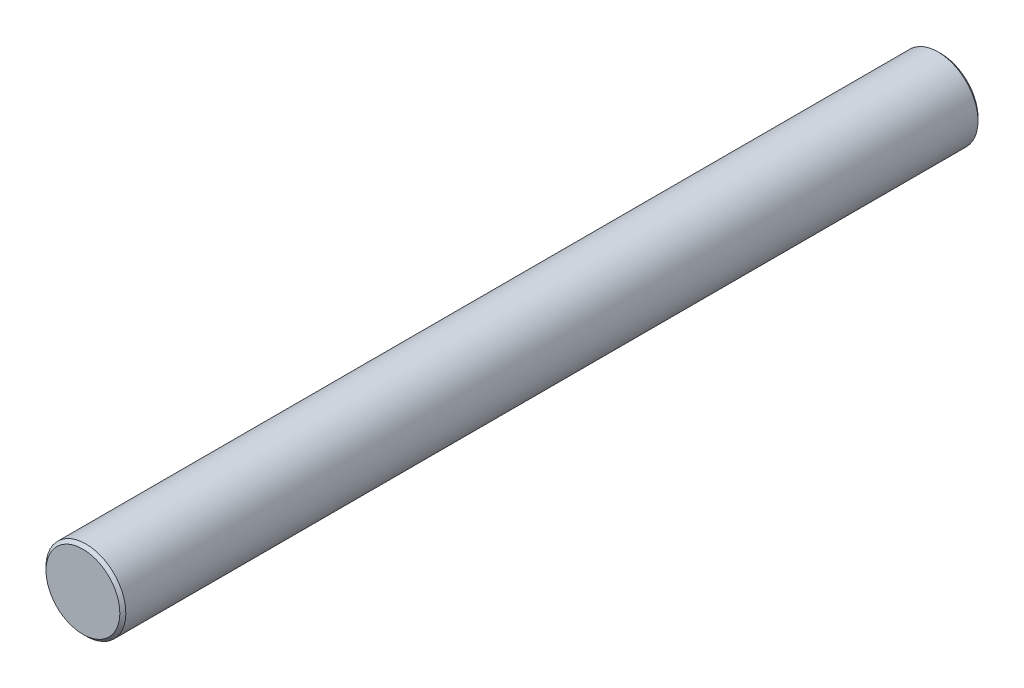
ISO-10303-21;
HEADER;
FILE_DESCRIPTION(('STEP AP214'),'2;1');
FILE_NAME('part.step','',(''),(''),'','','');
FILE_SCHEMA(('AUTOMOTIVE_DESIGN { 1 0 10303 214 1 1 1 1 }'));
ENDSEC;
DATA;
#1=APPLICATION_CONTEXT('core data for automotive mechanical design processes');
#2=APPLICATION_PROTOCOL_DEFINITION('international standard','automotive_design',2000,#1);
#3=PRODUCT_CONTEXT('',#1,'mechanical');
#4=PRODUCT('Part','Part','',(#3));
#5=PRODUCT_RELATED_PRODUCT_CATEGORY('part','',(#4));
#6=PRODUCT_DEFINITION_FORMATION('','',#4);
#7=PRODUCT_DEFINITION_CONTEXT('part definition',#1,'design');
#8=PRODUCT_DEFINITION('design','',#6,#7);
#9=PRODUCT_DEFINITION_SHAPE('','',#8);
#10=(LENGTH_UNIT() NAMED_UNIT(*) SI_UNIT(.MILLI.,.METRE.));
#11=(NAMED_UNIT(*) PLANE_ANGLE_UNIT() SI_UNIT($,.RADIAN.));
#12=(NAMED_UNIT(*) SI_UNIT($,.STERADIAN.) SOLID_ANGLE_UNIT());
#13=UNCERTAINTY_MEASURE_WITH_UNIT(LENGTH_MEASURE(1.E-05),#10,'distance_accuracy_value','');
#14=(GEOMETRIC_REPRESENTATION_CONTEXT(3) GLOBAL_UNCERTAINTY_ASSIGNED_CONTEXT((#13)) GLOBAL_UNIT_ASSIGNED_CONTEXT((#10,
#11,#12)) REPRESENTATION_CONTEXT('',''));
#15=CARTESIAN_POINT('',(0.,0.,0.));
#16=DIRECTION('',(0.,0.,1.));
#17=DIRECTION('',(1.,0.,0.));
#18=AXIS2_PLACEMENT_3D('',#15,#16,#17);
#19=CARTESIAN_POINT('',(0.,9.25,0.));
#20=DIRECTION('',(0.,0.,-1.));
#21=DIRECTION('',(0.,1.,0.));
#22=AXIS2_PLACEMENT_3D('',#19,#20,#21);
#23=PLANE('',#22);
#24=CARTESIAN_POINT('',(0.,0.,0.));
#25=DIRECTION('',(0.,0.,-1.));
#26=DIRECTION('',(0.,1.,0.));
#27=AXIS2_PLACEMENT_3D('',#24,#25,#26);
#28=CIRCLE('',#27,18.5);
#29=CARTESIAN_POINT('',(0.,18.5,0.));
#30=VERTEX_POINT('',#29);
#31=EDGE_CURVE('E9',#30,#30,#28,.T.);
#32=ORIENTED_EDGE('',*,*,#31,.T.);
#33=EDGE_LOOP('',(#32));
#34=FACE_BOUND('',#33,.T.);
#35=CARTESIAN_POINT('',(0.,0.,0.));
#36=DIRECTION('',(0.,0.,1.));
#37=DIRECTION('',(-1.,0.,0.));
#38=AXIS2_PLACEMENT_3D('',#35,#36,#37);
#39=CIRCLE('',#38,6.);
#40=CARTESIAN_POINT('',(-6.,0.,0.));
#41=VERTEX_POINT('',#40);
#42=EDGE_CURVE('E52',#41,#41,#39,.T.);
#43=ORIENTED_EDGE('',*,*,#42,.T.);
#44=EDGE_LOOP('',(#43));
#45=FACE_BOUND('',#44,.T.);
#46=ADVANCED_FACE('F15',(#34,#45),#23,.T.);
#47=CARTESIAN_POINT('',(0.,0.,0.75));
#48=DIRECTION('',(0.,0.,1.));
#49=DIRECTION('',(0.,1.,0.));
#50=AXIS2_PLACEMENT_3D('',#47,#48,#49);
#51=CONICAL_SURFACE('',#50,19.25,0.785398163397448);
#52=CARTESIAN_POINT('',(0.,0.,1.5));
#53=DIRECTION('',(0.,0.,-1.));
#54=DIRECTION('',(0.,1.,0.));
#55=AXIS2_PLACEMENT_3D('',#52,#53,#54);
#56=CIRCLE('',#55,20.);
#57=CARTESIAN_POINT('',(0.,20.,1.5));
#58=VERTEX_POINT('',#57);
#59=EDGE_CURVE('E25',#58,#58,#56,.T.);
#60=ORIENTED_EDGE('',*,*,#59,.T.);
#61=EDGE_LOOP('',(#60));
#62=FACE_BOUND('',#61,.T.);
#63=ORIENTED_EDGE('',*,*,#31,.F.);
#64=EDGE_LOOP('',(#63));
#65=FACE_BOUND('',#64,.T.);
#66=ADVANCED_FACE('F121',(#62,#65),#51,.T.);
#67=CARTESIAN_POINT('',(0.,0.,215.));
#68=DIRECTION('',(0.,0.,1.));
#69=DIRECTION('',(0.,1.,0.));
#70=AXIS2_PLACEMENT_3D('',#67,#68,#69);
#71=CYLINDRICAL_SURFACE('',#70,20.);
#72=CARTESIAN_POINT('',(0.,0.,428.5));
#73=DIRECTION('',(0.,0.,-1.));
#74=DIRECTION('',(0.,1.,0.));
#75=AXIS2_PLACEMENT_3D('',#72,#73,#74);
#76=CIRCLE('',#75,20.);
#77=CARTESIAN_POINT('',(0.,20.,428.5));
#78=VERTEX_POINT('',#77);
#79=EDGE_CURVE('E19',#78,#78,#76,.T.);
#80=ORIENTED_EDGE('',*,*,#79,.T.);
#81=EDGE_LOOP('',(#80));
#82=FACE_BOUND('',#81,.T.);
#83=ORIENTED_EDGE('',*,*,#59,.F.);
#84=EDGE_LOOP('',(#83));
#85=FACE_BOUND('',#84,.T.);
#86=CARTESIAN_POINT('',(0.,0.,6.5));
#87=DIRECTION('',(0.,0.,-1.));
#88=DIRECTION('',(0.,1.,0.));
#89=AXIS2_PLACEMENT_3D('',#86,#87,#88);
#90=CIRCLE('',#89,20.);
#91=CARTESIAN_POINT('',(10.5356537528527,-17.,6.5));
#92=VERTEX_POINT('',#91);
#93=CARTESIAN_POINT('',(-10.5356537528527,-17.,6.5));
#94=VERTEX_POINT('',#93);
#95=EDGE_CURVE('E69',#92,#94,#90,.T.);
#96=ORIENTED_EDGE('',*,*,#95,.T.);
#97=DIRECTION('',(0.,0.,1.));
#98=VECTOR('',#97,1.);
#99=CARTESIAN_POINT('',(-10.5356537528527,-17.,8.25));
#100=LINE('',#99,#98);
#101=CARTESIAN_POINT('',(-10.5356537528527,-17.,10.));
#102=VERTEX_POINT('',#101);
#103=EDGE_CURVE('E62',#94,#102,#100,.T.);
#104=ORIENTED_EDGE('',*,*,#103,.T.);
#105=CARTESIAN_POINT('',(0.,0.,10.));
#106=DIRECTION('',(0.,0.,1.));
#107=DIRECTION('',(0.,1.,0.));
#108=AXIS2_PLACEMENT_3D('',#105,#106,#107);
#109=CIRCLE('',#108,20.);
#110=CARTESIAN_POINT('',(10.5356537528527,-17.,10.));
#111=VERTEX_POINT('',#110);
#112=EDGE_CURVE('E75',#102,#111,#109,.T.);
#113=ORIENTED_EDGE('',*,*,#112,.T.);
#114=DIRECTION('',(0.,0.,-1.));
#115=VECTOR('',#114,1.);
#116=CARTESIAN_POINT('',(10.5356537528527,-17.,8.25));
#117=LINE('',#116,#115);
#118=EDGE_CURVE('E60',#111,#92,#117,.T.);
#119=ORIENTED_EDGE('',*,*,#118,.T.);
#120=EDGE_LOOP('',(#96,#104,#113,#119));
#121=FACE_BOUND('',#120,.T.);
#122=ADVANCED_FACE('F17',(#82,#85,#121),#71,.T.);
#123=CARTESIAN_POINT('',(0.,0.,429.25));
#124=DIRECTION('',(0.,0.,-1.));
#125=DIRECTION('',(0.,1.,0.));
#126=AXIS2_PLACEMENT_3D('',#123,#124,#125);
#127=CONICAL_SURFACE('',#126,19.25,0.785398163397448);
#128=CARTESIAN_POINT('',(0.,0.,430.));
#129=DIRECTION('',(0.,0.,-1.));
#130=DIRECTION('',(0.,1.,0.));
#131=AXIS2_PLACEMENT_3D('',#128,#129,#130);
#132=CIRCLE('',#131,18.5);
#133=CARTESIAN_POINT('',(0.,18.5,430.));
#134=VERTEX_POINT('',#133);
#135=EDGE_CURVE('E44',#134,#134,#132,.T.);
#136=ORIENTED_EDGE('',*,*,#135,.T.);
#137=EDGE_LOOP('',(#136));
#138=FACE_BOUND('',#137,.T.);
#139=ORIENTED_EDGE('',*,*,#79,.F.);
#140=EDGE_LOOP('',(#139));
#141=FACE_BOUND('',#140,.T.);
#142=ADVANCED_FACE('F116',(#138,#141),#127,.T.);
#143=CARTESIAN_POINT('',(0.,9.25,430.));
#144=DIRECTION('',(0.,0.,1.));
#145=DIRECTION('',(0.,-1.,0.));
#146=AXIS2_PLACEMENT_3D('',#143,#144,#145);
#147=PLANE('',#146);
#148=ORIENTED_EDGE('',*,*,#135,.F.);
#149=EDGE_LOOP('',(#148));
#150=FACE_BOUND('',#149,.T.);
#151=ADVANCED_FACE('F110',(#150),#147,.T.);
#152=CARTESIAN_POINT('',(0.,0.,26.4586213285198));
#153=DIRECTION('',(0.,0.,-1.));
#154=DIRECTION('',(-1.,0.,0.));
#155=AXIS2_PLACEMENT_3D('',#152,#153,#154);
#156=CONICAL_SURFACE('',#155,2.52640625,1.0471975511966);
#157=CARTESIAN_POINT('',(0.,0.,25.));
#158=DIRECTION('',(0.,0.,1.));
#159=DIRECTION('',(-1.,0.,0.));
#160=AXIS2_PLACEMENT_3D('',#157,#158,#159);
#161=CIRCLE('',#160,5.0528125);
#162=CARTESIAN_POINT('',(-5.0528125,0.,25.));
#163=VERTEX_POINT('',#162);
#164=EDGE_CURVE('E51',#163,#163,#161,.T.);
#165=ORIENTED_EDGE('',*,*,#164,.F.);
#166=EDGE_LOOP('',(#165));
#167=FACE_BOUND('',#166,.T.);
#168=CARTESIAN_POINT('',(0.,0.,27.9172426570397));
#169=VERTEX_POINT('',#168);
#170=VERTEX_LOOP('',#169);
#171=FACE_BOUND('',#170,.T.);
#172=ADVANCED_FACE('F104',(#167,#171),#156,.F.);
#173=CARTESIAN_POINT('',(0.,0.,12.97359375));
#174=DIRECTION('',(0.,0.,-1.));
#175=DIRECTION('',(-1.,0.,0.));
#176=AXIS2_PLACEMENT_3D('',#173,#174,#175);
#177=CYLINDRICAL_SURFACE('',#176,5.0528125);
#178=CARTESIAN_POINT('',(0.,0.,0.9471875));
#179=DIRECTION('',(0.,0.,1.));
#180=DIRECTION('',(-1.,0.,0.));
#181=AXIS2_PLACEMENT_3D('',#178,#179,#180);
#182=CIRCLE('',#181,5.0528125);
#183=CARTESIAN_POINT('',(-5.0528125,0.,0.9471875));
#184=VERTEX_POINT('',#183);
#185=EDGE_CURVE('E57',#184,#184,#182,.T.);
#186=ORIENTED_EDGE('',*,*,#185,.F.);
#187=EDGE_LOOP('',(#186));
#188=FACE_BOUND('',#187,.T.);
#189=ORIENTED_EDGE('',*,*,#164,.T.);
#190=EDGE_LOOP('',(#189));
#191=FACE_BOUND('',#190,.T.);
#192=ADVANCED_FACE('F101',(#188,#191),#177,.F.);
#193=CARTESIAN_POINT('',(0.,0.,0.47359375));
#194=DIRECTION('',(0.,0.,-1.));
#195=DIRECTION('',(-1.,0.,0.));
#196=AXIS2_PLACEMENT_3D('',#193,#194,#195);
#197=CONICAL_SURFACE('',#196,5.52640625,0.785398163397448);
#198=ORIENTED_EDGE('',*,*,#42,.F.);
#199=EDGE_LOOP('',(#198));
#200=FACE_BOUND('',#199,.T.);
#201=ORIENTED_EDGE('',*,*,#185,.T.);
#202=EDGE_LOOP('',(#201));
#203=FACE_BOUND('',#202,.T.);
#204=ADVANCED_FACE('F99',(#200,#203),#197,.F.);
#205=CARTESIAN_POINT('',(0.,-17.,8.25));
#206=DIRECTION('',(0.,-1.,0.));
#207=DIRECTION('',(0.,0.,-1.));
#208=AXIS2_PLACEMENT_3D('',#205,#206,#207);
#209=PLANE('',#208);
#210=ORIENTED_EDGE('',*,*,#103,.F.);
#211=DIRECTION('',(1.,0.,0.));
#212=VECTOR('',#211,1.);
#213=CARTESIAN_POINT('',(0.,-17.,6.5));
#214=LINE('',#213,#212);
#215=EDGE_CURVE('E66',#94,#92,#214,.T.);
#216=ORIENTED_EDGE('',*,*,#215,.T.);
#217=ORIENTED_EDGE('',*,*,#118,.F.);
#218=DIRECTION('',(-1.,0.,0.));
#219=VECTOR('',#218,1.);
#220=CARTESIAN_POINT('',(0.,-17.,10.));
#221=LINE('',#220,#219);
#222=EDGE_CURVE('E72',#111,#102,#221,.T.);
#223=ORIENTED_EDGE('',*,*,#222,.T.);
#224=EDGE_LOOP('',(#210,#216,#217,#223));
#225=FACE_BOUND('',#224,.T.);
#226=ADVANCED_FACE('F131',(#225),#209,.T.);
#227=CARTESIAN_POINT('',(0.,-19.5,6.5));
#228=DIRECTION('',(0.,0.,1.));
#229=DIRECTION('',(1.,0.,0.));
#230=AXIS2_PLACEMENT_3D('',#227,#228,#229);
#231=PLANE('',#230);
#232=ORIENTED_EDGE('',*,*,#95,.F.);
#233=ORIENTED_EDGE('',*,*,#215,.F.);
#234=EDGE_LOOP('',(#232,#233));
#235=FACE_BOUND('',#234,.T.);
#236=ADVANCED_FACE('F135',(#235),#231,.T.);
#237=CARTESIAN_POINT('',(0.,-19.5,10.));
#238=DIRECTION('',(0.,0.,1.));
#239=DIRECTION('',(1.,0.,0.));
#240=AXIS2_PLACEMENT_3D('',#237,#238,#239);
#241=PLANE('',#240);
#242=ORIENTED_EDGE('',*,*,#112,.F.);
#243=ORIENTED_EDGE('',*,*,#222,.F.);
#244=EDGE_LOOP('',(#242,#243));
#245=FACE_BOUND('',#244,.T.);
#246=ADVANCED_FACE('F87',(#245),#241,.F.);
#247=CLOSED_SHELL('',(#46,#66,#122,#142,#151,#172,#192,#204,#226,#236,#246));
#248=MANIFOLD_SOLID_BREP('B1',#247);
#249=ADVANCED_BREP_SHAPE_REPRESENTATION('',(#18,#248),#14);
#250=SHAPE_DEFINITION_REPRESENTATION(#9,#249);
ENDSEC;
END-ISO-10303-21;
